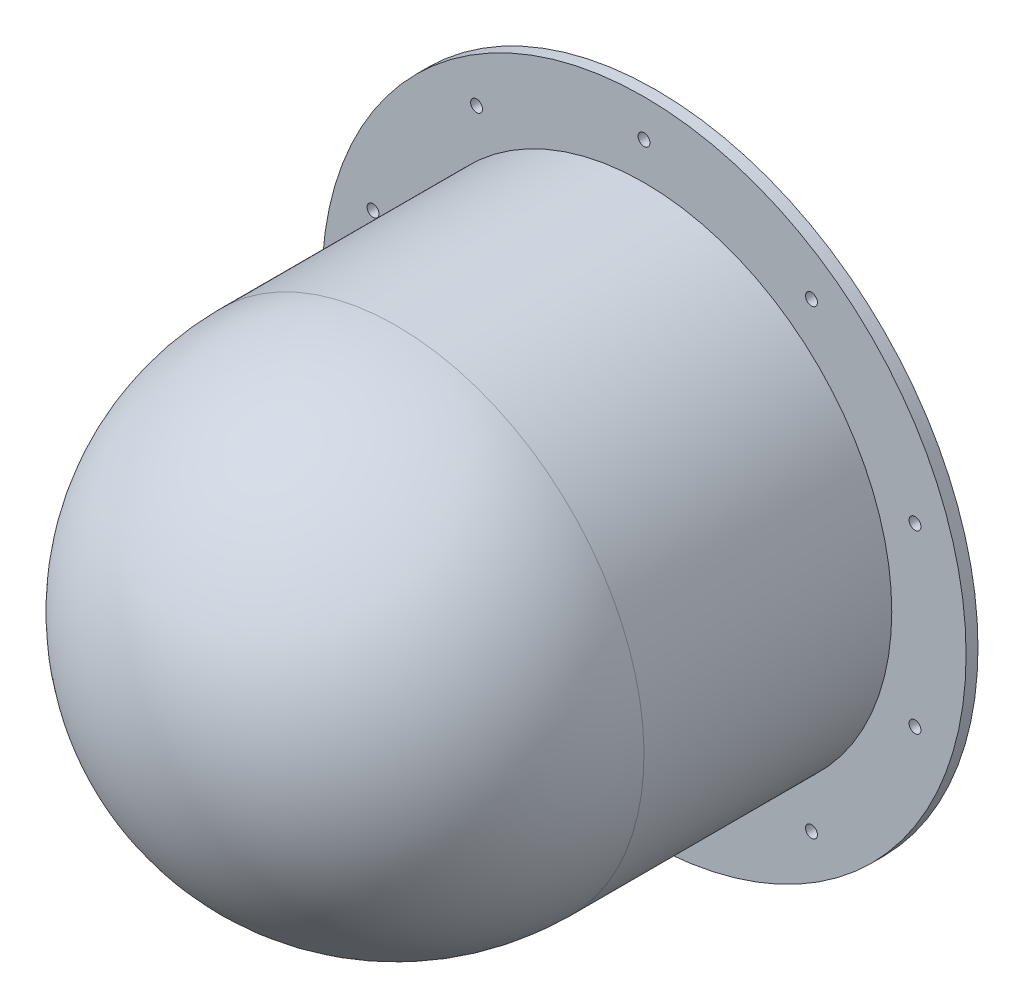
ISO-10303-21;
HEADER;
FILE_DESCRIPTION(('STEP AP214'),'2;1');
FILE_NAME('part.step','',(''),(''),'','','');
FILE_SCHEMA(('AUTOMOTIVE_DESIGN { 1 0 10303 214 1 1 1 1 }'));
ENDSEC;
DATA;
#1=APPLICATION_CONTEXT('core data for automotive mechanical design processes');
#2=APPLICATION_PROTOCOL_DEFINITION('international standard','automotive_design',2000,#1);
#3=PRODUCT_CONTEXT('',#1,'mechanical');
#4=PRODUCT('Part','Part','',(#3));
#5=PRODUCT_RELATED_PRODUCT_CATEGORY('part','',(#4));
#6=PRODUCT_DEFINITION_FORMATION('','',#4);
#7=PRODUCT_DEFINITION_CONTEXT('part definition',#1,'design');
#8=PRODUCT_DEFINITION('design','',#6,#7);
#9=PRODUCT_DEFINITION_SHAPE('','',#8);
#10=(LENGTH_UNIT() NAMED_UNIT(*) SI_UNIT(.MILLI.,.METRE.));
#11=(NAMED_UNIT(*) PLANE_ANGLE_UNIT() SI_UNIT($,.RADIAN.));
#12=(NAMED_UNIT(*) SI_UNIT($,.STERADIAN.) SOLID_ANGLE_UNIT());
#13=UNCERTAINTY_MEASURE_WITH_UNIT(LENGTH_MEASURE(1.E-05),#10,'distance_accuracy_value','');
#14=(GEOMETRIC_REPRESENTATION_CONTEXT(3) GLOBAL_UNCERTAINTY_ASSIGNED_CONTEXT((#13)) GLOBAL_UNIT_ASSIGNED_CONTEXT((#10,
#11,#12)) REPRESENTATION_CONTEXT('',''));
#15=CARTESIAN_POINT('',(0.,0.,0.));
#16=DIRECTION('',(0.,0.,1.));
#17=DIRECTION('',(1.,0.,0.));
#18=AXIS2_PLACEMENT_3D('',#15,#16,#17);
#19=CARTESIAN_POINT('',(0.,0.,12.));
#20=DIRECTION('',(0.,0.,1.));
#21=DIRECTION('',(1.,0.,0.));
#22=AXIS2_PLACEMENT_3D('',#19,#20,#21);
#23=PLANE('',#22);
#24=CARTESIAN_POINT('',(0.,0.,12.));
#25=DIRECTION('',(0.,0.,1.));
#26=DIRECTION('',(1.,0.,0.));
#27=AXIS2_PLACEMENT_3D('',#24,#25,#26);
#28=CIRCLE('',#27,250.);
#29=CARTESIAN_POINT('',(250.,0.,12.));
#30=VERTEX_POINT('',#29);
#31=EDGE_CURVE('E10',#30,#30,#28,.T.);
#32=ORIENTED_EDGE('',*,*,#31,.F.);
#33=EDGE_LOOP('',(#32));
#34=FACE_BOUND('',#33,.T.);
#35=CARTESIAN_POINT('',(-273.428748434856,88.8423858827975,12.));
#36=DIRECTION('',(0.,0.,1.));
#37=DIRECTION('',(1.,0.,0.));
#38=AXIS2_PLACEMENT_3D('',#35,#36,#37);
#39=CIRCLE('',#38,5.99999999999999);
#40=CARTESIAN_POINT('',(-267.428748434856,88.8423858827975,12.));
#41=VERTEX_POINT('',#40);
#42=EDGE_CURVE('E99',#41,#41,#39,.T.);
#43=ORIENTED_EDGE('',*,*,#42,.F.);
#44=EDGE_LOOP('',(#43));
#45=FACE_BOUND('',#44,.T.);
#46=CARTESIAN_POINT('',(-168.988260034086,-232.592385882797,12.));
#47=DIRECTION('',(0.,0.,1.));
#48=DIRECTION('',(1.,0.,0.));
#49=AXIS2_PLACEMENT_3D('',#46,#47,#48);
#50=CIRCLE('',#49,6.00000000000002);
#51=CARTESIAN_POINT('',(-162.988260034086,-232.592385882797,12.));
#52=VERTEX_POINT('',#51);
#53=EDGE_CURVE('E87',#52,#52,#50,.T.);
#54=ORIENTED_EDGE('',*,*,#53,.F.);
#55=EDGE_LOOP('',(#54));
#56=FACE_BOUND('',#55,.T.);
#57=CARTESIAN_POINT('',(168.988260034086,-232.592385882797,12.));
#58=DIRECTION('',(0.,0.,1.));
#59=DIRECTION('',(1.,0.,0.));
#60=AXIS2_PLACEMENT_3D('',#57,#58,#59);
#61=CIRCLE('',#60,6.00000000000002);
#62=CARTESIAN_POINT('',(174.988260034086,-232.592385882797,12.));
#63=VERTEX_POINT('',#62);
#64=EDGE_CURVE('E75',#63,#63,#61,.T.);
#65=ORIENTED_EDGE('',*,*,#64,.F.);
#66=EDGE_LOOP('',(#65));
#67=FACE_BOUND('',#66,.T.);
#68=CARTESIAN_POINT('',(273.428748434856,88.8423858827975,12.));
#69=DIRECTION('',(0.,0.,1.));
#70=DIRECTION('',(1.,0.,0.));
#71=AXIS2_PLACEMENT_3D('',#68,#69,#70);
#72=CIRCLE('',#71,5.99999999999999);
#73=CARTESIAN_POINT('',(279.428748434856,88.8423858827975,12.));
#74=VERTEX_POINT('',#73);
#75=EDGE_CURVE('E63',#74,#74,#72,.T.);
#76=ORIENTED_EDGE('',*,*,#75,.F.);
#77=EDGE_LOOP('',(#76));
#78=FACE_BOUND('',#77,.T.);
#79=CARTESIAN_POINT('',(0.,0.,12.));
#80=DIRECTION('',(0.,0.,1.));
#81=DIRECTION('',(1.,0.,0.));
#82=AXIS2_PLACEMENT_3D('',#79,#80,#81);
#83=CIRCLE('',#82,325.);
#84=CARTESIAN_POINT('',(325.,0.,12.));
#85=VERTEX_POINT('',#84);
#86=EDGE_CURVE('E40',#85,#85,#83,.T.);
#87=ORIENTED_EDGE('',*,*,#86,.T.);
#88=EDGE_LOOP('',(#87));
#89=FACE_BOUND('',#88,.T.);
#90=CARTESIAN_POINT('',(0.,287.5,12.));
#91=DIRECTION('',(0.,0.,1.));
#92=DIRECTION('',(1.,0.,0.));
#93=AXIS2_PLACEMENT_3D('',#90,#91,#92);
#94=CIRCLE('',#93,6.00000000000001);
#95=CARTESIAN_POINT('',(6.00000000000001,287.5,12.));
#96=VERTEX_POINT('',#95);
#97=EDGE_CURVE('E49',#96,#96,#94,.T.);
#98=ORIENTED_EDGE('',*,*,#97,.F.);
#99=EDGE_LOOP('',(#98));
#100=FACE_BOUND('',#99,.T.);
#101=CARTESIAN_POINT('',(168.988260034086,232.592385882797,12.));
#102=DIRECTION('',(0.,0.,1.));
#103=DIRECTION('',(1.,0.,0.));
#104=AXIS2_PLACEMENT_3D('',#101,#102,#103);
#105=CIRCLE('',#104,6.00000000000002);
#106=CARTESIAN_POINT('',(174.988260034086,232.592385882797,12.));
#107=VERTEX_POINT('',#106);
#108=EDGE_CURVE('E59',#107,#107,#105,.T.);
#109=ORIENTED_EDGE('',*,*,#108,.F.);
#110=EDGE_LOOP('',(#109));
#111=FACE_BOUND('',#110,.T.);
#112=CARTESIAN_POINT('',(273.428748434856,-88.8423858827971,12.));
#113=DIRECTION('',(0.,0.,1.));
#114=DIRECTION('',(1.,0.,0.));
#115=AXIS2_PLACEMENT_3D('',#112,#113,#114);
#116=CIRCLE('',#115,5.99999999999999);
#117=CARTESIAN_POINT('',(279.428748434856,-88.8423858827971,12.));
#118=VERTEX_POINT('',#117);
#119=EDGE_CURVE('E69',#118,#118,#116,.T.);
#120=ORIENTED_EDGE('',*,*,#119,.F.);
#121=EDGE_LOOP('',(#120));
#122=FACE_BOUND('',#121,.T.);
#123=CARTESIAN_POINT('',(0.,-287.5,12.));
#124=DIRECTION('',(0.,0.,1.));
#125=DIRECTION('',(1.,0.,0.));
#126=AXIS2_PLACEMENT_3D('',#123,#124,#125);
#127=CIRCLE('',#126,6.00000000000001);
#128=CARTESIAN_POINT('',(5.99999999999993,-287.5,12.));
#129=VERTEX_POINT('',#128);
#130=EDGE_CURVE('E81',#129,#129,#127,.T.);
#131=ORIENTED_EDGE('',*,*,#130,.F.);
#132=EDGE_LOOP('',(#131));
#133=FACE_BOUND('',#132,.T.);
#134=CARTESIAN_POINT('',(-273.428748434856,-88.8423858827971,12.));
#135=DIRECTION('',(0.,0.,1.));
#136=DIRECTION('',(1.,0.,0.));
#137=AXIS2_PLACEMENT_3D('',#134,#135,#136);
#138=CIRCLE('',#137,5.99999999999999);
#139=CARTESIAN_POINT('',(-267.428748434856,-88.8423858827971,12.));
#140=VERTEX_POINT('',#139);
#141=EDGE_CURVE('E93',#140,#140,#138,.T.);
#142=ORIENTED_EDGE('',*,*,#141,.F.);
#143=EDGE_LOOP('',(#142));
#144=FACE_BOUND('',#143,.T.);
#145=CARTESIAN_POINT('',(-168.988260034086,232.592385882797,12.));
#146=DIRECTION('',(0.,0.,1.));
#147=DIRECTION('',(1.,0.,0.));
#148=AXIS2_PLACEMENT_3D('',#145,#146,#147);
#149=CIRCLE('',#148,6.00000000000002);
#150=CARTESIAN_POINT('',(-162.988260034086,232.592385882797,12.));
#151=VERTEX_POINT('',#150);
#152=EDGE_CURVE('E105',#151,#151,#149,.T.);
#153=ORIENTED_EDGE('',*,*,#152,.F.);
#154=EDGE_LOOP('',(#153));
#155=FACE_BOUND('',#154,.T.);
#156=ADVANCED_FACE('F33',(#34,#45,#56,#67,#78,#89,#100,#111,#122,#133,#144,#155),#23,.T.);
#157=CARTESIAN_POINT('',(0.,0.,0.));
#158=DIRECTION('',(0.,0.,1.));
#159=DIRECTION('',(1.,0.,0.));
#160=AXIS2_PLACEMENT_3D('',#157,#158,#159);
#161=PLANE('',#160);
#162=CARTESIAN_POINT('',(0.,0.,0.));
#163=DIRECTION('',(0.,0.,1.));
#164=DIRECTION('',(1.,0.,0.));
#165=AXIS2_PLACEMENT_3D('',#162,#163,#164);
#166=CIRCLE('',#165,325.);
#167=CARTESIAN_POINT('',(325.,0.,0.));
#168=VERTEX_POINT('',#167);
#169=EDGE_CURVE('E44',#168,#168,#166,.T.);
#170=ORIENTED_EDGE('',*,*,#169,.F.);
#171=EDGE_LOOP('',(#170));
#172=FACE_BOUND('',#171,.T.);
#173=CARTESIAN_POINT('',(0.,287.5,0.));
#174=DIRECTION('',(0.,0.,1.));
#175=DIRECTION('',(1.,0.,0.));
#176=AXIS2_PLACEMENT_3D('',#173,#174,#175);
#177=CIRCLE('',#176,6.00000000000001);
#178=CARTESIAN_POINT('',(6.00000000000001,287.5,0.));
#179=VERTEX_POINT('',#178);
#180=EDGE_CURVE('E51',#179,#179,#177,.T.);
#181=ORIENTED_EDGE('',*,*,#180,.T.);
#182=EDGE_LOOP('',(#181));
#183=FACE_BOUND('',#182,.T.);
#184=CARTESIAN_POINT('',(0.,0.,0.));
#185=DIRECTION('',(0.,0.,1.));
#186=DIRECTION('',(1.,0.,0.));
#187=AXIS2_PLACEMENT_3D('',#184,#185,#186);
#188=CIRCLE('',#187,244.);
#189=CARTESIAN_POINT('',(244.,0.,0.));
#190=VERTEX_POINT('',#189);
#191=EDGE_CURVE('E54',#190,#190,#188,.T.);
#192=ORIENTED_EDGE('',*,*,#191,.T.);
#193=EDGE_LOOP('',(#192));
#194=FACE_BOUND('',#193,.T.);
#195=CARTESIAN_POINT('',(168.988260034086,232.592385882797,0.));
#196=DIRECTION('',(0.,0.,1.));
#197=DIRECTION('',(1.,0.,0.));
#198=AXIS2_PLACEMENT_3D('',#195,#196,#197);
#199=CIRCLE('',#198,6.00000000000002);
#200=CARTESIAN_POINT('',(174.988260034086,232.592385882797,0.));
#201=VERTEX_POINT('',#200);
#202=EDGE_CURVE('E60',#201,#201,#199,.T.);
#203=ORIENTED_EDGE('',*,*,#202,.T.);
#204=EDGE_LOOP('',(#203));
#205=FACE_BOUND('',#204,.T.);
#206=CARTESIAN_POINT('',(273.428748434856,88.8423858827975,0.));
#207=DIRECTION('',(0.,0.,1.));
#208=DIRECTION('',(1.,0.,0.));
#209=AXIS2_PLACEMENT_3D('',#206,#207,#208);
#210=CIRCLE('',#209,5.99999999999999);
#211=CARTESIAN_POINT('',(279.428748434856,88.8423858827975,0.));
#212=VERTEX_POINT('',#211);
#213=EDGE_CURVE('E66',#212,#212,#210,.T.);
#214=ORIENTED_EDGE('',*,*,#213,.T.);
#215=EDGE_LOOP('',(#214));
#216=FACE_BOUND('',#215,.T.);
#217=CARTESIAN_POINT('',(273.428748434856,-88.8423858827971,0.));
#218=DIRECTION('',(0.,0.,1.));
#219=DIRECTION('',(1.,0.,0.));
#220=AXIS2_PLACEMENT_3D('',#217,#218,#219);
#221=CIRCLE('',#220,5.99999999999999);
#222=CARTESIAN_POINT('',(279.428748434856,-88.8423858827971,0.));
#223=VERTEX_POINT('',#222);
#224=EDGE_CURVE('E72',#223,#223,#221,.T.);
#225=ORIENTED_EDGE('',*,*,#224,.T.);
#226=EDGE_LOOP('',(#225));
#227=FACE_BOUND('',#226,.T.);
#228=CARTESIAN_POINT('',(168.988260034086,-232.592385882797,0.));
#229=DIRECTION('',(0.,0.,1.));
#230=DIRECTION('',(1.,0.,0.));
#231=AXIS2_PLACEMENT_3D('',#228,#229,#230);
#232=CIRCLE('',#231,6.00000000000002);
#233=CARTESIAN_POINT('',(174.988260034086,-232.592385882797,0.));
#234=VERTEX_POINT('',#233);
#235=EDGE_CURVE('E78',#234,#234,#232,.T.);
#236=ORIENTED_EDGE('',*,*,#235,.T.);
#237=EDGE_LOOP('',(#236));
#238=FACE_BOUND('',#237,.T.);
#239=CARTESIAN_POINT('',(0.,-287.5,0.));
#240=DIRECTION('',(0.,0.,1.));
#241=DIRECTION('',(1.,0.,0.));
#242=AXIS2_PLACEMENT_3D('',#239,#240,#241);
#243=CIRCLE('',#242,6.00000000000001);
#244=CARTESIAN_POINT('',(5.99999999999993,-287.5,0.));
#245=VERTEX_POINT('',#244);
#246=EDGE_CURVE('E84',#245,#245,#243,.T.);
#247=ORIENTED_EDGE('',*,*,#246,.T.);
#248=EDGE_LOOP('',(#247));
#249=FACE_BOUND('',#248,.T.);
#250=CARTESIAN_POINT('',(-168.988260034086,-232.592385882797,0.));
#251=DIRECTION('',(0.,0.,1.));
#252=DIRECTION('',(1.,0.,0.));
#253=AXIS2_PLACEMENT_3D('',#250,#251,#252);
#254=CIRCLE('',#253,6.00000000000002);
#255=CARTESIAN_POINT('',(-162.988260034086,-232.592385882797,0.));
#256=VERTEX_POINT('',#255);
#257=EDGE_CURVE('E90',#256,#256,#254,.T.);
#258=ORIENTED_EDGE('',*,*,#257,.T.);
#259=EDGE_LOOP('',(#258));
#260=FACE_BOUND('',#259,.T.);
#261=CARTESIAN_POINT('',(-273.428748434856,-88.8423858827971,0.));
#262=DIRECTION('',(0.,0.,1.));
#263=DIRECTION('',(1.,0.,0.));
#264=AXIS2_PLACEMENT_3D('',#261,#262,#263);
#265=CIRCLE('',#264,5.99999999999999);
#266=CARTESIAN_POINT('',(-267.428748434856,-88.8423858827971,0.));
#267=VERTEX_POINT('',#266);
#268=EDGE_CURVE('E96',#267,#267,#265,.T.);
#269=ORIENTED_EDGE('',*,*,#268,.T.);
#270=EDGE_LOOP('',(#269));
#271=FACE_BOUND('',#270,.T.);
#272=CARTESIAN_POINT('',(-273.428748434856,88.8423858827975,0.));
#273=DIRECTION('',(0.,0.,1.));
#274=DIRECTION('',(1.,0.,0.));
#275=AXIS2_PLACEMENT_3D('',#272,#273,#274);
#276=CIRCLE('',#275,5.99999999999999);
#277=CARTESIAN_POINT('',(-267.428748434856,88.8423858827975,0.));
#278=VERTEX_POINT('',#277);
#279=EDGE_CURVE('E102',#278,#278,#276,.T.);
#280=ORIENTED_EDGE('',*,*,#279,.T.);
#281=EDGE_LOOP('',(#280));
#282=FACE_BOUND('',#281,.T.);
#283=CARTESIAN_POINT('',(-168.988260034086,232.592385882797,0.));
#284=DIRECTION('',(0.,0.,1.));
#285=DIRECTION('',(1.,0.,0.));
#286=AXIS2_PLACEMENT_3D('',#283,#284,#285);
#287=CIRCLE('',#286,6.00000000000002);
#288=CARTESIAN_POINT('',(-162.988260034086,232.592385882797,0.));
#289=VERTEX_POINT('',#288);
#290=EDGE_CURVE('E108',#289,#289,#287,.T.);
#291=ORIENTED_EDGE('',*,*,#290,.T.);
#292=EDGE_LOOP('',(#291));
#293=FACE_BOUND('',#292,.T.);
#294=ADVANCED_FACE('F139',(#172,#183,#194,#205,#216,#227,#238,#249,#260,#271,#282,#293),#161,.F.);
#295=CARTESIAN_POINT('',(0.,0.,12.));
#296=DIRECTION('',(0.,0.,-1.));
#297=DIRECTION('',(-1.,0.,0.));
#298=AXIS2_PLACEMENT_3D('',#295,#296,#297);
#299=CYLINDRICAL_SURFACE('',#298,325.);
#300=ORIENTED_EDGE('',*,*,#86,.F.);
#301=EDGE_LOOP('',(#300));
#302=FACE_BOUND('',#301,.T.);
#303=ORIENTED_EDGE('',*,*,#169,.T.);
#304=EDGE_LOOP('',(#303));
#305=FACE_BOUND('',#304,.T.);
#306=ADVANCED_FACE('F35',(#302,#305),#299,.T.);
#307=CARTESIAN_POINT('',(0.,287.5,12.));
#308=DIRECTION('',(0.,0.,-1.));
#309=DIRECTION('',(-1.,0.,0.));
#310=AXIS2_PLACEMENT_3D('',#307,#308,#309);
#311=CYLINDRICAL_SURFACE('',#310,6.00000000000001);
#312=ORIENTED_EDGE('',*,*,#97,.T.);
#313=EDGE_LOOP('',(#312));
#314=FACE_BOUND('',#313,.T.);
#315=ORIENTED_EDGE('',*,*,#180,.F.);
#316=EDGE_LOOP('',(#315));
#317=FACE_BOUND('',#316,.T.);
#318=ADVANCED_FACE('F125',(#314,#317),#311,.F.);
#319=CARTESIAN_POINT('',(0.,0.,12.));
#320=DIRECTION('',(0.,0.,-1.));
#321=DIRECTION('',(-1.,0.,0.));
#322=AXIS2_PLACEMENT_3D('',#319,#320,#321);
#323=CYLINDRICAL_SURFACE('',#322,244.);
#324=ORIENTED_EDGE('',*,*,#191,.F.);
#325=EDGE_LOOP('',(#324));
#326=FACE_BOUND('',#325,.T.);
#327=CARTESIAN_POINT('',(0.,0.,262.));
#328=DIRECTION('',(0.,0.,-1.));
#329=DIRECTION('',(0.,1.,0.));
#330=AXIS2_PLACEMENT_3D('',#327,#328,#329);
#331=CIRCLE('',#330,244.);
#332=CARTESIAN_POINT('',(0.,244.,262.));
#333=VERTEX_POINT('',#332);
#334=EDGE_CURVE('E116',#333,#333,#331,.T.);
#335=ORIENTED_EDGE('',*,*,#334,.F.);
#336=EDGE_LOOP('',(#335));
#337=FACE_BOUND('',#336,.T.);
#338=ADVANCED_FACE('F122',(#326,#337),#323,.F.);
#339=CARTESIAN_POINT('',(168.988260034086,232.592385882797,12.));
#340=DIRECTION('',(0.,0.,-1.));
#341=DIRECTION('',(-1.,0.,0.));
#342=AXIS2_PLACEMENT_3D('',#339,#340,#341);
#343=CYLINDRICAL_SURFACE('',#342,6.00000000000002);
#344=ORIENTED_EDGE('',*,*,#108,.T.);
#345=EDGE_LOOP('',(#344));
#346=FACE_BOUND('',#345,.T.);
#347=ORIENTED_EDGE('',*,*,#202,.F.);
#348=EDGE_LOOP('',(#347));
#349=FACE_BOUND('',#348,.T.);
#350=ADVANCED_FACE('F124',(#346,#349),#343,.F.);
#351=CARTESIAN_POINT('',(273.428748434856,88.8423858827975,12.));
#352=DIRECTION('',(0.,0.,-1.));
#353=DIRECTION('',(-1.,0.,0.));
#354=AXIS2_PLACEMENT_3D('',#351,#352,#353);
#355=CYLINDRICAL_SURFACE('',#354,5.99999999999999);
#356=ORIENTED_EDGE('',*,*,#75,.T.);
#357=EDGE_LOOP('',(#356));
#358=FACE_BOUND('',#357,.T.);
#359=ORIENTED_EDGE('',*,*,#213,.F.);
#360=EDGE_LOOP('',(#359));
#361=FACE_BOUND('',#360,.T.);
#362=ADVANCED_FACE('F132',(#358,#361),#355,.F.);
#363=CARTESIAN_POINT('',(273.428748434856,-88.8423858827971,12.));
#364=DIRECTION('',(0.,0.,-1.));
#365=DIRECTION('',(-1.,0.,0.));
#366=AXIS2_PLACEMENT_3D('',#363,#364,#365);
#367=CYLINDRICAL_SURFACE('',#366,5.99999999999999);
#368=ORIENTED_EDGE('',*,*,#119,.T.);
#369=EDGE_LOOP('',(#368));
#370=FACE_BOUND('',#369,.T.);
#371=ORIENTED_EDGE('',*,*,#224,.F.);
#372=EDGE_LOOP('',(#371));
#373=FACE_BOUND('',#372,.T.);
#374=ADVANCED_FACE('F200',(#370,#373),#367,.F.);
#375=CARTESIAN_POINT('',(168.988260034086,-232.592385882797,12.));
#376=DIRECTION('',(0.,0.,-1.));
#377=DIRECTION('',(-1.,0.,0.));
#378=AXIS2_PLACEMENT_3D('',#375,#376,#377);
#379=CYLINDRICAL_SURFACE('',#378,6.00000000000002);
#380=ORIENTED_EDGE('',*,*,#64,.T.);
#381=EDGE_LOOP('',(#380));
#382=FACE_BOUND('',#381,.T.);
#383=ORIENTED_EDGE('',*,*,#235,.F.);
#384=EDGE_LOOP('',(#383));
#385=FACE_BOUND('',#384,.T.);
#386=ADVANCED_FACE('F196',(#382,#385),#379,.F.);
#387=CARTESIAN_POINT('',(0.,-287.5,12.));
#388=DIRECTION('',(0.,0.,-1.));
#389=DIRECTION('',(-1.,0.,0.));
#390=AXIS2_PLACEMENT_3D('',#387,#388,#389);
#391=CYLINDRICAL_SURFACE('',#390,6.00000000000001);
#392=ORIENTED_EDGE('',*,*,#130,.T.);
#393=EDGE_LOOP('',(#392));
#394=FACE_BOUND('',#393,.T.);
#395=ORIENTED_EDGE('',*,*,#246,.F.);
#396=EDGE_LOOP('',(#395));
#397=FACE_BOUND('',#396,.T.);
#398=ADVANCED_FACE('F192',(#394,#397),#391,.F.);
#399=CARTESIAN_POINT('',(-168.988260034086,-232.592385882797,12.));
#400=DIRECTION('',(0.,0.,-1.));
#401=DIRECTION('',(-1.,0.,0.));
#402=AXIS2_PLACEMENT_3D('',#399,#400,#401);
#403=CYLINDRICAL_SURFACE('',#402,6.00000000000002);
#404=ORIENTED_EDGE('',*,*,#53,.T.);
#405=EDGE_LOOP('',(#404));
#406=FACE_BOUND('',#405,.T.);
#407=ORIENTED_EDGE('',*,*,#257,.F.);
#408=EDGE_LOOP('',(#407));
#409=FACE_BOUND('',#408,.T.);
#410=ADVANCED_FACE('F188',(#406,#409),#403,.F.);
#411=CARTESIAN_POINT('',(-273.428748434856,-88.8423858827971,12.));
#412=DIRECTION('',(0.,0.,-1.));
#413=DIRECTION('',(-1.,0.,0.));
#414=AXIS2_PLACEMENT_3D('',#411,#412,#413);
#415=CYLINDRICAL_SURFACE('',#414,5.99999999999999);
#416=ORIENTED_EDGE('',*,*,#141,.T.);
#417=EDGE_LOOP('',(#416));
#418=FACE_BOUND('',#417,.T.);
#419=ORIENTED_EDGE('',*,*,#268,.F.);
#420=EDGE_LOOP('',(#419));
#421=FACE_BOUND('',#420,.T.);
#422=ADVANCED_FACE('F180',(#418,#421),#415,.F.);
#423=CARTESIAN_POINT('',(-273.428748434856,88.8423858827975,12.));
#424=DIRECTION('',(0.,0.,-1.));
#425=DIRECTION('',(-1.,0.,0.));
#426=AXIS2_PLACEMENT_3D('',#423,#424,#425);
#427=CYLINDRICAL_SURFACE('',#426,5.99999999999999);
#428=ORIENTED_EDGE('',*,*,#42,.T.);
#429=EDGE_LOOP('',(#428));
#430=FACE_BOUND('',#429,.T.);
#431=ORIENTED_EDGE('',*,*,#279,.F.);
#432=EDGE_LOOP('',(#431));
#433=FACE_BOUND('',#432,.T.);
#434=ADVANCED_FACE('F170',(#430,#433),#427,.F.);
#435=CARTESIAN_POINT('',(-168.988260034086,232.592385882797,12.));
#436=DIRECTION('',(0.,0.,-1.));
#437=DIRECTION('',(-1.,0.,0.));
#438=AXIS2_PLACEMENT_3D('',#435,#436,#437);
#439=CYLINDRICAL_SURFACE('',#438,6.00000000000002);
#440=ORIENTED_EDGE('',*,*,#152,.T.);
#441=EDGE_LOOP('',(#440));
#442=FACE_BOUND('',#441,.T.);
#443=ORIENTED_EDGE('',*,*,#290,.F.);
#444=EDGE_LOOP('',(#443));
#445=FACE_BOUND('',#444,.T.);
#446=ADVANCED_FACE('F167',(#442,#445),#439,.F.);
#447=CARTESIAN_POINT('',(0.,-1.83697019872103E-13,262.));
#448=DIRECTION('',(0.,0.,-1.));
#449=DIRECTION('',(0.,1.,0.));
#450=AXIS2_PLACEMENT_3D('',#447,#448,#449);
#451=SPHERICAL_SURFACE('',#450,244.);
#452=ORIENTED_EDGE('',*,*,#334,.T.);
#453=EDGE_LOOP('',(#452));
#454=FACE_BOUND('',#453,.T.);
#455=ADVANCED_FACE('F120',(#454),#451,.F.);
#456=CARTESIAN_POINT('',(0.,0.,12.));
#457=DIRECTION('',(0.,0.,-1.));
#458=DIRECTION('',(0.,1.,0.));
#459=AXIS2_PLACEMENT_3D('',#456,#457,#458);
#460=CYLINDRICAL_SURFACE('',#459,250.);
#461=CARTESIAN_POINT('',(0.,0.,262.));
#462=DIRECTION('',(0.,0.,-1.));
#463=DIRECTION('',(0.,1.,0.));
#464=AXIS2_PLACEMENT_3D('',#461,#462,#463);
#465=CIRCLE('',#464,250.);
#466=CARTESIAN_POINT('',(0.,250.,262.));
#467=VERTEX_POINT('',#466);
#468=EDGE_CURVE('E111',#467,#467,#465,.T.);
#469=ORIENTED_EDGE('',*,*,#468,.T.);
#470=EDGE_LOOP('',(#469));
#471=FACE_BOUND('',#470,.T.);
#472=ORIENTED_EDGE('',*,*,#31,.T.);
#473=EDGE_LOOP('',(#472));
#474=FACE_BOUND('',#473,.T.);
#475=ADVANCED_FACE('F178',(#471,#474),#460,.T.);
#476=CARTESIAN_POINT('',(0.,-1.83697019872103E-13,262.));
#477=DIRECTION('',(0.,0.,-1.));
#478=DIRECTION('',(0.,1.,0.));
#479=AXIS2_PLACEMENT_3D('',#476,#477,#478);
#480=SPHERICAL_SURFACE('',#479,250.);
#481=ORIENTED_EDGE('',*,*,#468,.F.);
#482=EDGE_LOOP('',(#481));
#483=FACE_BOUND('',#482,.T.);
#484=ADVANCED_FACE('F285',(#483),#480,.T.);
#485=CLOSED_SHELL('',(#156,#294,#306,#318,#338,#350,#362,#374,#386,#398,#410,#422,#434,#446,
#455,#475,#484));
#486=MANIFOLD_SOLID_BREP('B2',#485);
#487=ADVANCED_BREP_SHAPE_REPRESENTATION('',(#18,#486),#14);
#488=SHAPE_DEFINITION_REPRESENTATION(#9,#487);
ENDSEC;
END-ISO-10303-21;
